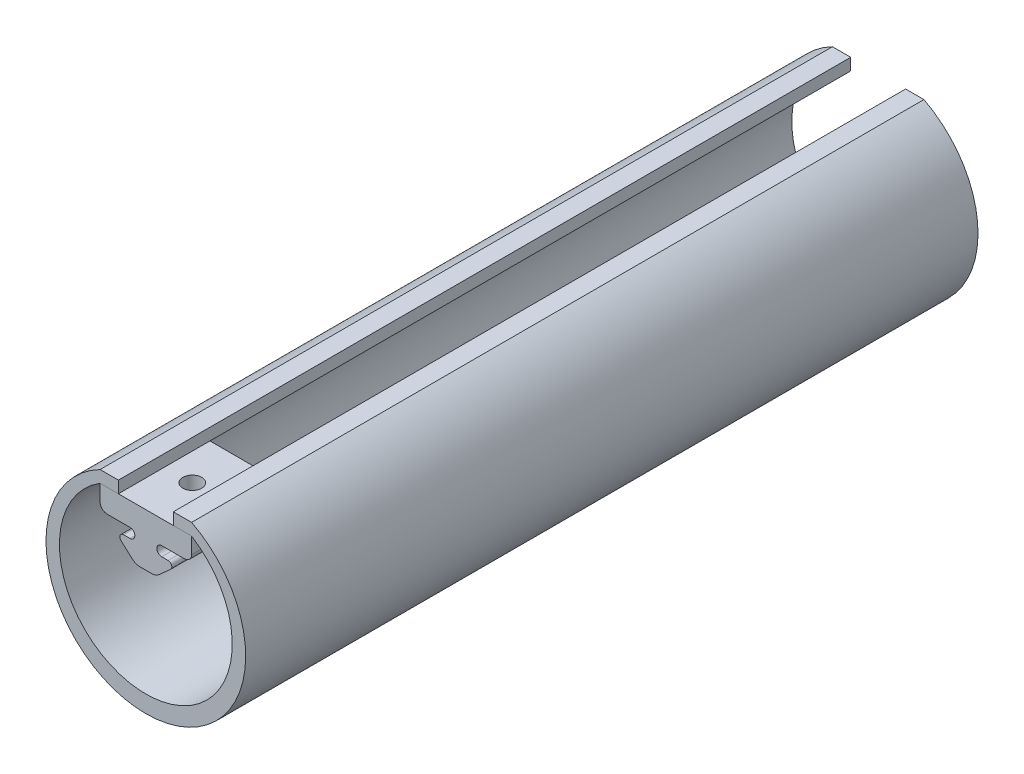
ISO-10303-21;
HEADER;
FILE_DESCRIPTION(('STEP AP214'),'2;1');
FILE_NAME('part.step','',(''),(''),'','','');
FILE_SCHEMA(('AUTOMOTIVE_DESIGN { 1 0 10303 214 1 1 1 1 }'));
ENDSEC;
DATA;
#1=APPLICATION_CONTEXT('core data for automotive mechanical design processes');
#2=APPLICATION_PROTOCOL_DEFINITION('international standard','automotive_design',2000,#1);
#3=PRODUCT_CONTEXT('',#1,'mechanical');
#4=PRODUCT('Part','Part','',(#3));
#5=PRODUCT_RELATED_PRODUCT_CATEGORY('part','',(#4));
#6=PRODUCT_DEFINITION_FORMATION('','',#4);
#7=PRODUCT_DEFINITION_CONTEXT('part definition',#1,'design');
#8=PRODUCT_DEFINITION('design','',#6,#7);
#9=PRODUCT_DEFINITION_SHAPE('','',#8);
#10=(LENGTH_UNIT() NAMED_UNIT(*) SI_UNIT(.MILLI.,.METRE.));
#11=(NAMED_UNIT(*) PLANE_ANGLE_UNIT() SI_UNIT($,.RADIAN.));
#12=(NAMED_UNIT(*) SI_UNIT($,.STERADIAN.) SOLID_ANGLE_UNIT());
#13=UNCERTAINTY_MEASURE_WITH_UNIT(LENGTH_MEASURE(1.E-05),#10,'distance_accuracy_value','');
#14=(GEOMETRIC_REPRESENTATION_CONTEXT(3) GLOBAL_UNCERTAINTY_ASSIGNED_CONTEXT((#13)) GLOBAL_UNIT_ASSIGNED_CONTEXT((#10,
#11,#12)) REPRESENTATION_CONTEXT('',''));
#15=CARTESIAN_POINT('',(0.,0.,0.));
#16=DIRECTION('',(0.,0.,1.));
#17=DIRECTION('',(1.,0.,0.));
#18=AXIS2_PLACEMENT_3D('',#15,#16,#17);
#19=CARTESIAN_POINT('',(0.00499999999999459,-0.919738421910336,-200.));
#20=DIRECTION('',(0.,0.,1.));
#21=DIRECTION('',(1.,0.,0.));
#22=AXIS2_PLACEMENT_3D('',#19,#20,#21);
#23=CYLINDRICAL_SURFACE('',#22,23.5974522798012);
#24=CARTESIAN_POINT('',(0.00499999999999459,-0.919738421910336,0.));
#25=DIRECTION('',(0.,0.,1.));
#26=DIRECTION('',(1.,0.,0.));
#27=AXIS2_PLACEMENT_3D('',#24,#25,#26);
#28=CIRCLE('',#27,23.5974522798012);
#29=CARTESIAN_POINT('',(-12.495,19.095,0.));
#30=VERTEX_POINT('',#29);
#31=CARTESIAN_POINT('',(12.505,19.095,0.));
#32=VERTEX_POINT('',#31);
#33=EDGE_CURVE('E158',#30,#32,#28,.T.);
#34=ORIENTED_EDGE('',*,*,#33,.T.);
#35=DIRECTION('',(0.,0.,1.));
#36=VECTOR('',#35,1.);
#37=CARTESIAN_POINT('',(12.505,19.095,-200.));
#38=LINE('',#37,#36);
#39=CARTESIAN_POINT('',(12.505,19.095,-200.));
#40=VERTEX_POINT('',#39);
#41=EDGE_CURVE('E12',#40,#32,#38,.T.);
#42=ORIENTED_EDGE('',*,*,#41,.F.);
#43=CARTESIAN_POINT('',(0.00499999999999459,-0.919738421910336,-200.));
#44=DIRECTION('',(0.,0.,1.));
#45=DIRECTION('',(1.,0.,0.));
#46=AXIS2_PLACEMENT_3D('',#43,#44,#45);
#47=CIRCLE('',#46,23.5974522798012);
#48=CARTESIAN_POINT('',(-12.495,19.095,-200.));
#49=VERTEX_POINT('',#48);
#50=EDGE_CURVE('E181',#49,#40,#47,.T.);
#51=ORIENTED_EDGE('',*,*,#50,.F.);
#52=DIRECTION('',(0.,0.,1.));
#53=VECTOR('',#52,1.);
#54=CARTESIAN_POINT('',(-12.495,19.095,-200.));
#55=LINE('',#54,#53);
#56=EDGE_CURVE('E62',#49,#30,#55,.T.);
#57=ORIENTED_EDGE('',*,*,#56,.T.);
#58=EDGE_LOOP('',(#34,#42,#51,#57));
#59=FACE_BOUND('',#58,.T.);
#60=ADVANCED_FACE('F59',(#59),#23,.F.);
#61=CARTESIAN_POINT('',(0.,19.095,-200.));
#62=DIRECTION('',(0.,1.,0.));
#63=DIRECTION('',(0.,0.,1.));
#64=AXIS2_PLACEMENT_3D('',#61,#62,#63);
#65=PLANE('',#64);
#66=DIRECTION('',(-1.,0.,0.));
#67=VECTOR('',#66,1.);
#68=CARTESIAN_POINT('',(0.,19.095,0.));
#69=LINE('',#68,#67);
#70=CARTESIAN_POINT('',(7.50499999999998,19.095,0.));
#71=VERTEX_POINT('',#70);
#72=EDGE_CURVE('E111',#32,#71,#69,.T.);
#73=ORIENTED_EDGE('',*,*,#72,.T.);
#74=DIRECTION('',(0.,0.,1.));
#75=VECTOR('',#74,1.);
#76=CARTESIAN_POINT('',(7.50499999999998,19.095,-200.));
#77=LINE('',#76,#75);
#78=CARTESIAN_POINT('',(7.50499999999998,19.095,-200.));
#79=VERTEX_POINT('',#78);
#80=EDGE_CURVE('E69',#79,#71,#77,.T.);
#81=ORIENTED_EDGE('',*,*,#80,.F.);
#82=DIRECTION('',(-1.,0.,0.));
#83=VECTOR('',#82,1.);
#84=CARTESIAN_POINT('',(0.,19.095,-200.));
#85=LINE('',#84,#83);
#86=EDGE_CURVE('E77',#40,#79,#85,.T.);
#87=ORIENTED_EDGE('',*,*,#86,.F.);
#88=ORIENTED_EDGE('',*,*,#41,.T.);
#89=EDGE_LOOP('',(#73,#81,#87,#88));
#90=FACE_BOUND('',#89,.T.);
#91=ADVANCED_FACE('F219',(#90),#65,.F.);
#92=CARTESIAN_POINT('',(7.50499999999998,0.,-200.));
#93=DIRECTION('',(-1.,0.,0.));
#94=DIRECTION('',(0.,0.,1.));
#95=AXIS2_PLACEMENT_3D('',#92,#93,#94);
#96=PLANE('',#95);
#97=DIRECTION('',(0.,-1.,0.));
#98=VECTOR('',#97,1.);
#99=CARTESIAN_POINT('',(7.50499999999998,0.,0.));
#100=LINE('',#99,#98);
#101=CARTESIAN_POINT('',(7.50499999999998,22.3323580948041,0.));
#102=VERTEX_POINT('',#101);
#103=EDGE_CURVE('E136',#102,#71,#100,.T.);
#104=ORIENTED_EDGE('',*,*,#103,.F.);
#105=DIRECTION('',(0.,0.,1.));
#106=VECTOR('',#105,1.);
#107=CARTESIAN_POINT('',(7.50499999999998,22.3323580948041,-200.));
#108=LINE('',#107,#106);
#109=CARTESIAN_POINT('',(7.50499999999998,22.3323580948041,-200.));
#110=VERTEX_POINT('',#109);
#111=EDGE_CURVE('E131',#110,#102,#108,.T.);
#112=ORIENTED_EDGE('',*,*,#111,.F.);
#113=DIRECTION('',(0.,-1.,0.));
#114=VECTOR('',#113,1.);
#115=CARTESIAN_POINT('',(7.50499999999998,0.,-200.));
#116=LINE('',#115,#114);
#117=EDGE_CURVE('E135',#110,#79,#116,.T.);
#118=ORIENTED_EDGE('',*,*,#117,.T.);
#119=ORIENTED_EDGE('',*,*,#80,.T.);
#120=EDGE_LOOP('',(#104,#112,#118,#119));
#121=FACE_BOUND('',#120,.T.);
#122=ADVANCED_FACE('F133',(#121),#96,.T.);
#123=CARTESIAN_POINT('',(0.,22.3323580948041,-200.));
#124=DIRECTION('',(0.,-1.,0.));
#125=DIRECTION('',(0.,0.,-1.));
#126=AXIS2_PLACEMENT_3D('',#123,#124,#125);
#127=PLANE('',#126);
#128=DIRECTION('',(1.,0.,0.));
#129=VECTOR('',#128,1.);
#130=CARTESIAN_POINT('',(0.,22.3323580948041,0.));
#131=LINE('',#130,#129);
#132=CARTESIAN_POINT('',(12.505,22.3323580948041,0.));
#133=VERTEX_POINT('',#132);
#134=EDGE_CURVE('E175',#102,#133,#131,.T.);
#135=ORIENTED_EDGE('',*,*,#134,.T.);
#136=DIRECTION('',(0.,0.,1.));
#137=VECTOR('',#136,1.);
#138=CARTESIAN_POINT('',(12.505,22.3323580948041,-200.));
#139=LINE('',#138,#137);
#140=CARTESIAN_POINT('',(12.505,22.3323580948041,-200.));
#141=VERTEX_POINT('',#140);
#142=EDGE_CURVE('E141',#141,#133,#139,.T.);
#143=ORIENTED_EDGE('',*,*,#142,.F.);
#144=DIRECTION('',(1.,0.,0.));
#145=VECTOR('',#144,1.);
#146=CARTESIAN_POINT('',(0.,22.3323580948041,-200.));
#147=LINE('',#146,#145);
#148=EDGE_CURVE('E144',#110,#141,#147,.T.);
#149=ORIENTED_EDGE('',*,*,#148,.F.);
#150=ORIENTED_EDGE('',*,*,#111,.T.);
#151=EDGE_LOOP('',(#135,#143,#149,#150));
#152=FACE_BOUND('',#151,.T.);
#153=ADVANCED_FACE('F145',(#152),#127,.F.);
#154=CARTESIAN_POINT('',(0.00499999999999459,-1.9006750931802,-200.));
#155=DIRECTION('',(0.,0.,1.));
#156=DIRECTION('',(1.,0.,0.));
#157=AXIS2_PLACEMENT_3D('',#154,#155,#156);
#158=CYLINDRICAL_SURFACE('',#157,27.2670111579899);
#159=CARTESIAN_POINT('',(0.00499999999999459,-1.9006750931802,0.));
#160=DIRECTION('',(0.,0.,1.));
#161=DIRECTION('',(1.,0.,0.));
#162=AXIS2_PLACEMENT_3D('',#159,#160,#161);
#163=CIRCLE('',#162,27.2670111579899);
#164=CARTESIAN_POINT('',(-12.495,22.3323580948041,0.));
#165=VERTEX_POINT('',#164);
#166=EDGE_CURVE('E171',#165,#133,#163,.T.);
#167=ORIENTED_EDGE('',*,*,#166,.F.);
#168=DIRECTION('',(0.,0.,1.));
#169=VECTOR('',#168,1.);
#170=CARTESIAN_POINT('',(-12.495,22.3323580948041,-200.));
#171=LINE('',#170,#169);
#172=CARTESIAN_POINT('',(-12.495,22.3323580948041,-200.));
#173=VERTEX_POINT('',#172);
#174=EDGE_CURVE('E187',#173,#165,#171,.T.);
#175=ORIENTED_EDGE('',*,*,#174,.F.);
#176=CARTESIAN_POINT('',(0.00499999999999459,-1.9006750931802,-200.));
#177=DIRECTION('',(0.,0.,1.));
#178=DIRECTION('',(1.,0.,0.));
#179=AXIS2_PLACEMENT_3D('',#176,#177,#178);
#180=CIRCLE('',#179,27.2670111579899);
#181=EDGE_CURVE('E149',#173,#141,#180,.T.);
#182=ORIENTED_EDGE('',*,*,#181,.T.);
#183=ORIENTED_EDGE('',*,*,#142,.T.);
#184=EDGE_LOOP('',(#167,#175,#182,#183));
#185=FACE_BOUND('',#184,.T.);
#186=ADVANCED_FACE('F232',(#185),#158,.T.);
#187=CARTESIAN_POINT('',(0.,22.3323580948041,-200.));
#188=DIRECTION('',(0.,-1.,0.));
#189=DIRECTION('',(0.,0.,-1.));
#190=AXIS2_PLACEMENT_3D('',#187,#188,#189);
#191=PLANE('',#190);
#192=DIRECTION('',(1.,0.,0.));
#193=VECTOR('',#192,1.);
#194=CARTESIAN_POINT('',(0.,22.3323580948041,0.));
#195=LINE('',#194,#193);
#196=CARTESIAN_POINT('',(-7.49499999999999,22.3323580948041,0.));
#197=VERTEX_POINT('',#196);
#198=EDGE_CURVE('E168',#165,#197,#195,.T.);
#199=ORIENTED_EDGE('',*,*,#198,.T.);
#200=DIRECTION('',(0.,0.,1.));
#201=VECTOR('',#200,1.);
#202=CARTESIAN_POINT('',(-7.49499999999999,22.3323580948041,-200.));
#203=LINE('',#202,#201);
#204=CARTESIAN_POINT('',(-7.49499999999999,22.3323580948041,-200.));
#205=VERTEX_POINT('',#204);
#206=EDGE_CURVE('E190',#205,#197,#203,.T.);
#207=ORIENTED_EDGE('',*,*,#206,.F.);
#208=DIRECTION('',(1.,0.,0.));
#209=VECTOR('',#208,1.);
#210=CARTESIAN_POINT('',(0.,22.3323580948041,-200.));
#211=LINE('',#210,#209);
#212=EDGE_CURVE('E246',#173,#205,#211,.T.);
#213=ORIENTED_EDGE('',*,*,#212,.F.);
#214=ORIENTED_EDGE('',*,*,#174,.T.);
#215=EDGE_LOOP('',(#199,#207,#213,#214));
#216=FACE_BOUND('',#215,.T.);
#217=ADVANCED_FACE('F215',(#216),#191,.F.);
#218=CARTESIAN_POINT('',(-7.49499999999999,0.,-200.));
#219=DIRECTION('',(-1.,0.,0.));
#220=DIRECTION('',(0.,-1.,0.));
#221=AXIS2_PLACEMENT_3D('',#218,#219,#220);
#222=PLANE('',#221);
#223=DIRECTION('',(0.,-1.,0.));
#224=VECTOR('',#223,1.);
#225=CARTESIAN_POINT('',(-7.49499999999999,0.,0.));
#226=LINE('',#225,#224);
#227=CARTESIAN_POINT('',(-7.49499999999999,19.095,0.));
#228=VERTEX_POINT('',#227);
#229=EDGE_CURVE('E165',#197,#228,#226,.T.);
#230=ORIENTED_EDGE('',*,*,#229,.T.);
#231=DIRECTION('',(0.,0.,1.));
#232=VECTOR('',#231,1.);
#233=CARTESIAN_POINT('',(-7.49499999999999,19.095,-200.));
#234=LINE('',#233,#232);
#235=CARTESIAN_POINT('',(-7.49499999999999,19.095,-200.));
#236=VERTEX_POINT('',#235);
#237=EDGE_CURVE('E193',#236,#228,#234,.T.);
#238=ORIENTED_EDGE('',*,*,#237,.F.);
#239=DIRECTION('',(0.,-1.,0.));
#240=VECTOR('',#239,1.);
#241=CARTESIAN_POINT('',(-7.49499999999999,0.,-200.));
#242=LINE('',#241,#240);
#243=EDGE_CURVE('E244',#205,#236,#242,.T.);
#244=ORIENTED_EDGE('',*,*,#243,.F.);
#245=ORIENTED_EDGE('',*,*,#206,.T.);
#246=EDGE_LOOP('',(#230,#238,#244,#245));
#247=FACE_BOUND('',#246,.T.);
#248=ADVANCED_FACE('F209',(#247),#222,.F.);
#249=CARTESIAN_POINT('',(0.,19.095,-200.));
#250=DIRECTION('',(0.,1.,0.));
#251=DIRECTION('',(0.,0.,1.));
#252=AXIS2_PLACEMENT_3D('',#249,#250,#251);
#253=PLANE('',#252);
#254=DIRECTION('',(-1.,0.,0.));
#255=VECTOR('',#254,1.);
#256=CARTESIAN_POINT('',(0.,19.095,0.));
#257=LINE('',#256,#255);
#258=EDGE_CURVE('E162',#228,#30,#257,.T.);
#259=ORIENTED_EDGE('',*,*,#258,.T.);
#260=ORIENTED_EDGE('',*,*,#56,.F.);
#261=DIRECTION('',(-1.,0.,0.));
#262=VECTOR('',#261,1.);
#263=CARTESIAN_POINT('',(0.,19.095,-200.));
#264=LINE('',#263,#262);
#265=EDGE_CURVE('E118',#236,#49,#264,.T.);
#266=ORIENTED_EDGE('',*,*,#265,.F.);
#267=ORIENTED_EDGE('',*,*,#237,.T.);
#268=EDGE_LOOP('',(#259,#260,#266,#267));
#269=FACE_BOUND('',#268,.T.);
#270=ADVANCED_FACE('F207',(#269),#253,.F.);
#271=CARTESIAN_POINT('',(0.,0.,-200.));
#272=DIRECTION('',(0.,0.,1.));
#273=DIRECTION('',(1.,0.,0.));
#274=AXIS2_PLACEMENT_3D('',#271,#272,#273);
#275=PLANE('',#274);
#276=ORIENTED_EDGE('',*,*,#50,.T.);
#277=ORIENTED_EDGE('',*,*,#86,.T.);
#278=ORIENTED_EDGE('',*,*,#117,.F.);
#279=ORIENTED_EDGE('',*,*,#148,.T.);
#280=ORIENTED_EDGE('',*,*,#181,.F.);
#281=ORIENTED_EDGE('',*,*,#212,.T.);
#282=ORIENTED_EDGE('',*,*,#243,.T.);
#283=ORIENTED_EDGE('',*,*,#265,.T.);
#284=EDGE_LOOP('',(#276,#277,#278,#279,#280,#281,#282,#283));
#285=FACE_BOUND('',#284,.T.);
#286=ADVANCED_FACE('F151',(#285),#275,.F.);
#287=CARTESIAN_POINT('',(0.,0.,0.));
#288=DIRECTION('',(0.,0.,1.));
#289=DIRECTION('',(1.,0.,0.));
#290=AXIS2_PLACEMENT_3D('',#287,#288,#289);
#291=PLANE('',#290);
#292=ORIENTED_EDGE('',*,*,#33,.F.);
#293=ORIENTED_EDGE('',*,*,#258,.F.);
#294=ORIENTED_EDGE('',*,*,#229,.F.);
#295=ORIENTED_EDGE('',*,*,#198,.F.);
#296=ORIENTED_EDGE('',*,*,#166,.T.);
#297=ORIENTED_EDGE('',*,*,#134,.F.);
#298=ORIENTED_EDGE('',*,*,#103,.T.);
#299=ORIENTED_EDGE('',*,*,#72,.F.);
#300=EDGE_LOOP('',(#292,#293,#294,#295,#296,#297,#298,#299));
#301=FACE_BOUND('',#300,.T.);
#302=ADVANCED_FACE('F204',(#301),#291,.T.);
#303=CLOSED_SHELL('',(#60,#91,#122,#153,#186,#217,#248,#270,#286,#302));
#304=MANIFOLD_SOLID_BREP('B2',#303);
#305=CARTESIAN_POINT('',(1.55040670748285,4.775,-25.));
#306=DIRECTION('',(0.,-1.,0.));
#307=DIRECTION('',(0.,0.,-1.));
#308=AXIS2_PLACEMENT_3D('',#305,#306,#307);
#309=PLANE('',#308);
#310=CARTESIAN_POINT('',(0.,4.775,-12.7));
#311=DIRECTION('',(0.,1.,0.));
#312=DIRECTION('',(1.,0.,0.));
#313=AXIS2_PLACEMENT_3D('',#310,#311,#312);
#314=CIRCLE('',#313,2.5796875);
#315=CARTESIAN_POINT('',(-1.55040670748285,4.775,-10.6381982056831));
#316=VERTEX_POINT('',#315);
#317=CARTESIAN_POINT('',(1.55040670748285,4.775,-10.6381982056831));
#318=VERTEX_POINT('',#317);
#319=EDGE_CURVE('E352',#316,#318,#314,.T.);
#320=ORIENTED_EDGE('',*,*,#319,.T.);
#321=DIRECTION('',(0.,0.,1.));
#322=VECTOR('',#321,1.);
#323=CARTESIAN_POINT('',(1.55040670748285,4.775,-25.));
#324=LINE('',#323,#322);
#325=CARTESIAN_POINT('',(1.55040670748285,4.775,0.));
#326=VERTEX_POINT('',#325);
#327=EDGE_CURVE('E567',#318,#326,#324,.T.);
#328=ORIENTED_EDGE('',*,*,#327,.T.);
#329=DIRECTION('',(1.,0.,0.));
#330=VECTOR('',#329,1.);
#331=CARTESIAN_POINT('',(1.55040670748285,4.775,0.));
#332=LINE('',#331,#330);
#333=CARTESIAN_POINT('',(-1.55040670748285,4.775,0.));
#334=VERTEX_POINT('',#333);
#335=EDGE_CURVE('E539',#334,#326,#332,.T.);
#336=ORIENTED_EDGE('',*,*,#335,.F.);
#337=DIRECTION('',(0.,0.,1.));
#338=VECTOR('',#337,1.);
#339=CARTESIAN_POINT('',(-1.55040670748285,4.775,-25.));
#340=LINE('',#339,#338);
#341=EDGE_CURVE('E571',#316,#334,#340,.T.);
#342=ORIENTED_EDGE('',*,*,#341,.F.);
#343=EDGE_LOOP('',(#320,#328,#336,#342));
#344=FACE_BOUND('',#343,.T.);
#345=ADVANCED_FACE('F335',(#344),#309,.T.);
#346=CARTESIAN_POINT('',(10.5420688349756,14.7079056929128,-25.));
#347=DIRECTION('',(0.,0.,1.));
#348=DIRECTION('',(1.,0.,0.));
#349=AXIS2_PLACEMENT_3D('',#346,#347,#348);
#350=CYLINDRICAL_SURFACE('',#349,1.96293116518964);
#351=CARTESIAN_POINT('',(10.5420688349756,14.7079056929128,0.));
#352=DIRECTION('',(0.,0.,1.));
#353=DIRECTION('',(1.,0.,0.));
#354=AXIS2_PLACEMENT_3D('',#351,#352,#353);
#355=CIRCLE('',#354,1.96293116518964);
#356=CARTESIAN_POINT('',(10.5320688348104,12.745,0.));
#357=VERTEX_POINT('',#356);
#358=CARTESIAN_POINT('',(12.505,14.7079311651897,0.));
#359=VERTEX_POINT('',#358);
#360=EDGE_CURVE('E505',#357,#359,#355,.T.);
#361=ORIENTED_EDGE('',*,*,#360,.F.);
#362=DIRECTION('',(0.,0.,1.));
#363=VECTOR('',#362,1.);
#364=CARTESIAN_POINT('',(10.5320688348104,12.745,-25.));
#365=LINE('',#364,#363);
#366=CARTESIAN_POINT('',(10.5320688348104,12.745,-25.));
#367=VERTEX_POINT('',#366);
#368=EDGE_CURVE('E57',#367,#357,#365,.T.);
#369=ORIENTED_EDGE('',*,*,#368,.F.);
#370=CARTESIAN_POINT('',(10.5420688349756,14.7079056929128,-25.));
#371=DIRECTION('',(0.,0.,1.));
#372=DIRECTION('',(1.,0.,0.));
#373=AXIS2_PLACEMENT_3D('',#370,#371,#372);
#374=CIRCLE('',#373,1.96293116518964);
#375=CARTESIAN_POINT('',(12.505,14.7079311651897,-25.));
#376=VERTEX_POINT('',#375);
#377=EDGE_CURVE('E556',#367,#376,#374,.T.);
#378=ORIENTED_EDGE('',*,*,#377,.T.);
#379=DIRECTION('',(0.,0.,1.));
#380=VECTOR('',#379,1.);
#381=CARTESIAN_POINT('',(12.505,14.7079311651897,-25.));
#382=LINE('',#381,#380);
#383=EDGE_CURVE('E339',#376,#359,#382,.T.);
#384=ORIENTED_EDGE('',*,*,#383,.T.);
#385=EDGE_LOOP('',(#361,#369,#378,#384));
#386=FACE_BOUND('',#385,.T.);
#387=ADVANCED_FACE('F337',(#386),#350,.T.);
#388=CARTESIAN_POINT('',(4.315,12.745,-25.));
#389=DIRECTION('',(0.,-1.,0.));
#390=DIRECTION('',(1.,0.,0.));
#391=AXIS2_PLACEMENT_3D('',#388,#389,#390);
#392=PLANE('',#391);
#393=DIRECTION('',(1.,0.,0.));
#394=VECTOR('',#393,1.);
#395=CARTESIAN_POINT('',(4.315,12.745,0.));
#396=LINE('',#395,#394);
#397=CARTESIAN_POINT('',(4.315,12.745,0.));
#398=VERTEX_POINT('',#397);
#399=EDGE_CURVE('E554',#398,#357,#396,.T.);
#400=ORIENTED_EDGE('',*,*,#399,.F.);
#401=DIRECTION('',(0.,0.,1.));
#402=VECTOR('',#401,1.);
#403=CARTESIAN_POINT('',(4.315,12.745,-25.));
#404=LINE('',#403,#402);
#405=CARTESIAN_POINT('',(4.315,12.745,-25.));
#406=VERTEX_POINT('',#405);
#407=EDGE_CURVE('E344',#406,#398,#404,.T.);
#408=ORIENTED_EDGE('',*,*,#407,.F.);
#409=DIRECTION('',(1.,0.,0.));
#410=VECTOR('',#409,1.);
#411=CARTESIAN_POINT('',(4.315,12.745,-25.));
#412=LINE('',#411,#410);
#413=EDGE_CURVE('E495',#406,#367,#412,.T.);
#414=ORIENTED_EDGE('',*,*,#413,.T.);
#415=ORIENTED_EDGE('',*,*,#368,.T.);
#416=EDGE_LOOP('',(#400,#408,#414,#415));
#417=FACE_BOUND('',#416,.T.);
#418=ADVANCED_FACE('F592',(#417),#392,.T.);
#419=CARTESIAN_POINT('',(4.315,11.43,-25.));
#420=DIRECTION('',(0.,0.,1.));
#421=DIRECTION('',(1.,0.,0.));
#422=AXIS2_PLACEMENT_3D('',#419,#420,#421);
#423=CYLINDRICAL_SURFACE('',#422,1.315);
#424=CARTESIAN_POINT('',(4.315,11.43,0.));
#425=DIRECTION('',(0.,0.,-1.));
#426=DIRECTION('',(-1.,0.,0.));
#427=AXIS2_PLACEMENT_3D('',#424,#425,#426);
#428=CIRCLE('',#427,1.315);
#429=CARTESIAN_POINT('',(4.315,10.115,0.));
#430=VERTEX_POINT('',#429);
#431=EDGE_CURVE('E482',#430,#398,#428,.T.);
#432=ORIENTED_EDGE('',*,*,#431,.F.);
#433=DIRECTION('',(0.,0.,1.));
#434=VECTOR('',#433,1.);
#435=CARTESIAN_POINT('',(4.315,10.115,-25.));
#436=LINE('',#435,#434);
#437=CARTESIAN_POINT('',(4.315,10.115,-25.));
#438=VERTEX_POINT('',#437);
#439=EDGE_CURVE('E476',#438,#430,#436,.T.);
#440=ORIENTED_EDGE('',*,*,#439,.F.);
#441=CARTESIAN_POINT('',(4.315,11.43,-25.));
#442=DIRECTION('',(0.,0.,-1.));
#443=DIRECTION('',(-1.,0.,0.));
#444=AXIS2_PLACEMENT_3D('',#441,#442,#443);
#445=CIRCLE('',#444,1.315);
#446=EDGE_CURVE('E479',#438,#406,#445,.T.);
#447=ORIENTED_EDGE('',*,*,#446,.T.);
#448=ORIENTED_EDGE('',*,*,#407,.T.);
#449=EDGE_LOOP('',(#432,#440,#447,#448));
#450=FACE_BOUND('',#449,.T.);
#451=ADVANCED_FACE('F478',(#450),#423,.F.);
#452=CARTESIAN_POINT('',(6.085,10.115,-25.));
#453=DIRECTION('',(0.,1.,0.));
#454=DIRECTION('',(-1.,0.,0.));
#455=AXIS2_PLACEMENT_3D('',#452,#453,#454);
#456=PLANE('',#455);
#457=DIRECTION('',(-1.,0.,0.));
#458=VECTOR('',#457,1.);
#459=CARTESIAN_POINT('',(6.085,10.115,0.));
#460=LINE('',#459,#458);
#461=CARTESIAN_POINT('',(6.085,10.115,0.));
#462=VERTEX_POINT('',#461);
#463=EDGE_CURVE('E551',#462,#430,#460,.T.);
#464=ORIENTED_EDGE('',*,*,#463,.F.);
#465=DIRECTION('',(0.,0.,1.));
#466=VECTOR('',#465,1.);
#467=CARTESIAN_POINT('',(6.085,10.115,-25.));
#468=LINE('',#467,#466);
#469=CARTESIAN_POINT('',(6.085,10.115,-25.));
#470=VERTEX_POINT('',#469);
#471=EDGE_CURVE('E487',#470,#462,#468,.T.);
#472=ORIENTED_EDGE('',*,*,#471,.F.);
#473=DIRECTION('',(-1.,0.,0.));
#474=VECTOR('',#473,1.);
#475=CARTESIAN_POINT('',(6.085,10.115,-25.));
#476=LINE('',#475,#474);
#477=EDGE_CURVE('E493',#470,#438,#476,.T.);
#478=ORIENTED_EDGE('',*,*,#477,.T.);
#479=ORIENTED_EDGE('',*,*,#439,.T.);
#480=EDGE_LOOP('',(#464,#472,#478,#479));
#481=FACE_BOUND('',#480,.T.);
#482=ADVANCED_FACE('F497',(#481),#456,.T.);
#483=CARTESIAN_POINT('',(6.085,9.105,-25.));
#484=DIRECTION('',(0.,0.,1.));
#485=DIRECTION('',(1.,0.,0.));
#486=AXIS2_PLACEMENT_3D('',#483,#484,#485);
#487=CYLINDRICAL_SURFACE('',#486,1.01);
#488=CARTESIAN_POINT('',(6.085,9.105,0.));
#489=DIRECTION('',(0.,0.,1.));
#490=DIRECTION('',(-1.,0.,0.));
#491=AXIS2_PLACEMENT_3D('',#488,#489,#490);
#492=CIRCLE('',#491,1.01);
#493=CARTESIAN_POINT('',(6.75861440261653,8.3524419380622,0.));
#494=VERTEX_POINT('',#493);
#495=EDGE_CURVE('E548',#494,#462,#492,.T.);
#496=ORIENTED_EDGE('',*,*,#495,.F.);
#497=DIRECTION('',(0.,0.,1.));
#498=VECTOR('',#497,1.);
#499=CARTESIAN_POINT('',(6.75861440261653,8.3524419380622,-25.));
#500=LINE('',#499,#498);
#501=CARTESIAN_POINT('',(6.75861440261653,8.3524419380622,-25.));
#502=VERTEX_POINT('',#501);
#503=EDGE_CURVE('E560',#502,#494,#500,.T.);
#504=ORIENTED_EDGE('',*,*,#503,.F.);
#505=CARTESIAN_POINT('',(6.085,9.105,-25.));
#506=DIRECTION('',(0.,0.,1.));
#507=DIRECTION('',(-1.,0.,0.));
#508=AXIS2_PLACEMENT_3D('',#505,#506,#507);
#509=CIRCLE('',#508,1.01);
#510=EDGE_CURVE('E498',#502,#470,#509,.T.);
#511=ORIENTED_EDGE('',*,*,#510,.T.);
#512=ORIENTED_EDGE('',*,*,#471,.T.);
#513=EDGE_LOOP('',(#496,#504,#511,#512));
#514=FACE_BOUND('',#513,.T.);
#515=ADVANCED_FACE('F809',(#514),#487,.T.);
#516=CARTESIAN_POINT('',(3.66462220876442,5.58301083530413,-25.));
#517=DIRECTION('',(0.66694495308567,-0.745106992017625,0.));
#518=DIRECTION('',(0.745106992017625,0.66694495308567,0.));
#519=AXIS2_PLACEMENT_3D('',#516,#517,#518);
#520=PLANE('',#519);
#521=DIRECTION('',(0.745106992017625,0.66694495308567,0.));
#522=VECTOR('',#521,1.);
#523=CARTESIAN_POINT('',(3.66462220876442,5.58301083530413,0.));
#524=LINE('',#523,#522);
#525=CARTESIAN_POINT('',(3.66462220876443,5.58301083530413,0.));
#526=VERTEX_POINT('',#525);
#527=EDGE_CURVE('E545',#526,#494,#524,.T.);
#528=ORIENTED_EDGE('',*,*,#527,.F.);
#529=DIRECTION('',(0.,0.,1.));
#530=VECTOR('',#529,1.);
#531=CARTESIAN_POINT('',(3.66462220876443,5.58301083530413,-25.));
#532=LINE('',#531,#530);
#533=CARTESIAN_POINT('',(3.66462220876443,5.58301083530413,-25.));
#534=VERTEX_POINT('',#533);
#535=EDGE_CURVE('E562',#534,#526,#532,.T.);
#536=ORIENTED_EDGE('',*,*,#535,.F.);
#537=DIRECTION('',(0.745106992017625,0.66694495308567,0.));
#538=VECTOR('',#537,1.);
#539=CARTESIAN_POINT('',(3.66462220876442,5.58301083530413,-25.));
#540=LINE('',#539,#538);
#541=EDGE_CURVE('E500',#534,#502,#540,.T.);
#542=ORIENTED_EDGE('',*,*,#541,.T.);
#543=ORIENTED_EDGE('',*,*,#503,.T.);
#544=EDGE_LOOP('',(#528,#536,#542,#543));
#545=FACE_BOUND('',#544,.T.);
#546=ADVANCED_FACE('F619',(#545),#520,.T.);
#547=CARTESIAN_POINT('',(1.55040670748285,7.945,-25.));
#548=DIRECTION('',(0.,0.,1.));
#549=DIRECTION('',(1.,0.,0.));
#550=AXIS2_PLACEMENT_3D('',#547,#548,#549);
#551=CYLINDRICAL_SURFACE('',#550,3.17);
#552=CARTESIAN_POINT('',(1.55040670748285,4.775,-14.7618017943169));
#553=CARTESIAN_POINT('',(1.60740604045821,4.77499829120057,-14.7189442153994));
#554=CARTESIAN_POINT('',(1.66257781547106,4.77653731473618,-14.6737514092));
#555=CARTESIAN_POINT('',(1.76889322437959,4.78209114792903,-14.5790601482722));
#556=CARTESIAN_POINT('',(1.8200397355736,4.78610417068436,-14.5295648232791));
#557=CARTESIAN_POINT('',(1.96675242160227,4.80092576356998,-14.3753361028821));
#558=CARTESIAN_POINT('',(2.05588565359025,4.81452303115963,-14.2646380502744));
#559=CARTESIAN_POINT('',(2.21449192978436,4.84428771040433,-14.0307074588259));
#560=CARTESIAN_POINT('',(2.28400175412247,4.86045022395167,-13.9074989658865));
#561=CARTESIAN_POINT('',(2.40208492778134,4.89094173572603,-13.6511445881945));
#562=CARTESIAN_POINT('',(2.45065409260614,4.90527036709316,-13.5179967235234));
#563=CARTESIAN_POINT('',(2.5265358132137,4.92875618427653,-13.2409544194539));
#564=CARTESIAN_POINT('',(2.55316856059788,4.93774573071455,-13.0968575992915));
#565=CARTESIAN_POINT('',(2.58164280081133,4.94738521681886,-12.8059969458529));
#566=CARTESIAN_POINT('',(2.5834968215375,4.94803937077535,-12.6592344978822));
#567=CARTESIAN_POINT('',(2.56292430361789,4.94103637635508,-12.3753134598267));
#568=CARTESIAN_POINT('',(2.54174874989054,4.93380739133914,-12.238050777274));
#569=CARTESIAN_POINT('',(2.47782190838669,4.91351351507231,-11.969028095893));
#570=CARTESIAN_POINT('',(2.43505524938557,4.90044446690321,-11.8372720898594));
#571=CARTESIAN_POINT('',(2.32818141432141,4.87138999447564,-11.5801199210287));
#572=CARTESIAN_POINT('',(2.26368296217278,4.85535372422185,-11.4548928775934));
#573=CARTESIAN_POINT('',(2.11514865887475,4.82479365840991,-11.2165573027427));
#574=CARTESIAN_POINT('',(2.03113896127296,4.81026787554665,-11.1034328425033));
#575=CARTESIAN_POINT('',(1.88018012417873,4.7916558313887,-10.9315294685844));
#576=CARTESIAN_POINT('',(1.8185579372326,4.78569660671739,-10.8682201108708));
#577=CARTESIAN_POINT('',(1.68903568915766,4.77736654680655,-10.748139136869));
#578=CARTESIAN_POINT('',(1.62113573935703,4.77499564794554,-10.6913674046842));
#579=CARTESIAN_POINT('',(1.55040670748285,4.775,-10.6381982056831));
#580=B_SPLINE_CURVE_WITH_KNOTS('',3,(#552,#553,#554,#555,#556,#557,#558,#559,#560,#561,#562,
#563,#564,#565,#566,#567,#568,#569,#570,#571,#572,#573,#574,#575,#576,#577,#578,#579),
.UNSPECIFIED.,.F.,.F.,(4,2,2,2,2,2,2,2,2,2,2,2,2,4),(0.,0.213764562147627,0.427374908600162,
0.853505887428197,1.27883278487419,1.70424463450298,2.14239063810355,2.58031511071875,
2.99558733329452,3.41115561588503,3.83464594255289,4.25757185141178,4.52272455689054,
4.78787256112298),.UNSPECIFIED.);
#581=CARTESIAN_POINT('',(1.55040670748285,4.775,-14.7618017943169));
#582=VERTEX_POINT('',#581);
#583=EDGE_CURVE('E509',#582,#318,#580,.T.);
#584=ORIENTED_EDGE('',*,*,#583,.F.);
#585=CARTESIAN_POINT('',(1.55040670748285,4.775,-25.));
#586=VERTEX_POINT('',#585);
#587=EDGE_CURVE('E564',#586,#582,#324,.T.);
#588=ORIENTED_EDGE('',*,*,#587,.F.);
#589=CARTESIAN_POINT('',(1.55040670748285,7.945,-25.));
#590=DIRECTION('',(0.,0.,1.));
#591=DIRECTION('',(-1.,0.,0.));
#592=AXIS2_PLACEMENT_3D('',#589,#590,#591);
#593=CIRCLE('',#592,3.17);
#594=EDGE_CURVE('E641',#586,#534,#593,.T.);
#595=ORIENTED_EDGE('',*,*,#594,.T.);
#596=ORIENTED_EDGE('',*,*,#535,.T.);
#597=CARTESIAN_POINT('',(1.55040670748285,7.945,0.));
#598=DIRECTION('',(0.,0.,1.));
#599=DIRECTION('',(-1.,0.,0.));
#600=AXIS2_PLACEMENT_3D('',#597,#598,#599);
#601=CIRCLE('',#600,3.17);
#602=EDGE_CURVE('E542',#326,#526,#601,.T.);
#603=ORIENTED_EDGE('',*,*,#602,.F.);
#604=ORIENTED_EDGE('',*,*,#327,.F.);
#605=EDGE_LOOP('',(#584,#588,#595,#596,#603,#604));
#606=FACE_BOUND('',#605,.T.);
#607=ADVANCED_FACE('F611',(#606),#551,.T.);
#608=CARTESIAN_POINT('',(-1.55040670748285,4.775,-14.7618017943169));
#609=VERTEX_POINT('',#608);
#610=EDGE_CURVE('E624',#582,#609,#314,.T.);
#611=ORIENTED_EDGE('',*,*,#610,.T.);
#612=CARTESIAN_POINT('',(-1.55040670748285,4.775,-25.));
#613=VERTEX_POINT('',#612);
#614=EDGE_CURVE('E568',#613,#609,#340,.T.);
#615=ORIENTED_EDGE('',*,*,#614,.F.);
#616=DIRECTION('',(1.,0.,0.));
#617=VECTOR('',#616,1.);
#618=CARTESIAN_POINT('',(1.55040670748285,4.775,-25.));
#619=LINE('',#618,#617);
#620=EDGE_CURVE('E638',#613,#586,#619,.T.);
#621=ORIENTED_EDGE('',*,*,#620,.T.);
#622=ORIENTED_EDGE('',*,*,#587,.T.);
#623=EDGE_LOOP('',(#611,#615,#621,#622));
#624=FACE_BOUND('',#623,.T.);
#625=ADVANCED_FACE('F604',(#624),#309,.T.);
#626=CARTESIAN_POINT('',(-1.55040670748285,7.945,-25.));
#627=DIRECTION('',(0.,0.,1.));
#628=DIRECTION('',(1.,0.,0.));
#629=AXIS2_PLACEMENT_3D('',#626,#627,#628);
#630=CYLINDRICAL_SURFACE('',#629,3.17);
#631=CARTESIAN_POINT('',(-1.55040670748285,4.775,-10.6381982056831));
#632=CARTESIAN_POINT('',(-1.60740604045821,4.77499829120057,-10.6810557846006));
#633=CARTESIAN_POINT('',(-1.66257781547106,4.77653731473618,-10.7262485908));
#634=CARTESIAN_POINT('',(-1.76889322437958,4.78209114792903,-10.8209398517278));
#635=CARTESIAN_POINT('',(-1.8200397355736,4.78610417068436,-10.8704351767209));
#636=CARTESIAN_POINT('',(-1.96675242160227,4.80092576356998,-11.0246638971179));
#637=CARTESIAN_POINT('',(-2.05588565359025,4.81452303115963,-11.1353619497256));
#638=CARTESIAN_POINT('',(-2.21449192978436,4.84428771040433,-11.3692925411741));
#639=CARTESIAN_POINT('',(-2.28400175412247,4.86045022395167,-11.4925010341135));
#640=CARTESIAN_POINT('',(-2.40208492778134,4.89094173572603,-11.7488554118055));
#641=CARTESIAN_POINT('',(-2.45065409260614,4.90527036709316,-11.8820032764766));
#642=CARTESIAN_POINT('',(-2.5265358132137,4.92875618427653,-12.1590455805461));
#643=CARTESIAN_POINT('',(-2.55316856059788,4.93774573071455,-12.3031424007085));
#644=CARTESIAN_POINT('',(-2.58164280081134,4.94738521681886,-12.5940030541471));
#645=CARTESIAN_POINT('',(-2.5834968215375,4.94803937077535,-12.7407655021178));
#646=CARTESIAN_POINT('',(-2.56292430361789,4.94103637635508,-13.0246865401733));
#647=CARTESIAN_POINT('',(-2.54174874989054,4.93380739133914,-13.161949222726));
#648=CARTESIAN_POINT('',(-2.47782190838669,4.91351351507232,-13.430971904107));
#649=CARTESIAN_POINT('',(-2.43505524938557,4.90044446690321,-13.5627279101406));
#650=CARTESIAN_POINT('',(-2.32818141432142,4.87138999447565,-13.8198800789713));
#651=CARTESIAN_POINT('',(-2.26368296217278,4.85535372422185,-13.9451071224066));
#652=CARTESIAN_POINT('',(-2.11514865887475,4.82479365840991,-14.1834426972573));
#653=CARTESIAN_POINT('',(-2.03113896127297,4.81026787554665,-14.2965671574967));
#654=CARTESIAN_POINT('',(-1.88018012417873,4.7916558313887,-14.4684705314156));
#655=CARTESIAN_POINT('',(-1.8185579372326,4.78569660671739,-14.5317798891292));
#656=CARTESIAN_POINT('',(-1.68903568915766,4.77736654680655,-14.651860863131));
#657=CARTESIAN_POINT('',(-1.62113573935704,4.77499564794554,-14.7086325953158));
#658=CARTESIAN_POINT('',(-1.55040670748285,4.775,-14.7618017943169));
#659=B_SPLINE_CURVE_WITH_KNOTS('',3,(#631,#632,#633,#634,#635,#636,#637,#638,#639,#640,#641,
#642,#643,#644,#645,#646,#647,#648,#649,#650,#651,#652,#653,#654,#655,#656,#657,#658),
.UNSPECIFIED.,.F.,.F.,(4,2,2,2,2,2,2,2,2,2,2,2,2,4),(0.,0.213764562147627,0.427374908600162,
0.853505887428196,1.27883278487418,1.70424463450298,2.14239063810355,2.58031511071874,
2.99558733329451,3.41115561588503,3.83464594255288,4.25757185141178,4.52272455689054,
4.78787256112298),.UNSPECIFIED.);
#660=EDGE_CURVE('E629',#316,#609,#659,.T.);
#661=ORIENTED_EDGE('',*,*,#660,.F.);
#662=ORIENTED_EDGE('',*,*,#341,.T.);
#663=CARTESIAN_POINT('',(-1.55040670748285,7.945,0.));
#664=DIRECTION('',(0.,0.,1.));
#665=DIRECTION('',(1.,0.,0.));
#666=AXIS2_PLACEMENT_3D('',#663,#664,#665);
#667=CIRCLE('',#666,3.17);
#668=CARTESIAN_POINT('',(-3.66462220876442,5.58301083530413,0.));
#669=VERTEX_POINT('',#668);
#670=EDGE_CURVE('E536',#669,#334,#667,.T.);
#671=ORIENTED_EDGE('',*,*,#670,.F.);
#672=DIRECTION('',(0.,0.,1.));
#673=VECTOR('',#672,1.);
#674=CARTESIAN_POINT('',(-3.66462220876442,5.58301083530413,-25.));
#675=LINE('',#674,#673);
#676=CARTESIAN_POINT('',(-3.66462220876442,5.58301083530413,-25.));
#677=VERTEX_POINT('',#676);
#678=EDGE_CURVE('E572',#677,#669,#675,.T.);
#679=ORIENTED_EDGE('',*,*,#678,.F.);
#680=CARTESIAN_POINT('',(-1.55040670748285,7.945,-25.));
#681=DIRECTION('',(0.,0.,1.));
#682=DIRECTION('',(1.,0.,0.));
#683=AXIS2_PLACEMENT_3D('',#680,#681,#682);
#684=CIRCLE('',#683,3.17);
#685=EDGE_CURVE('E634',#677,#613,#684,.T.);
#686=ORIENTED_EDGE('',*,*,#685,.T.);
#687=ORIENTED_EDGE('',*,*,#614,.T.);
#688=EDGE_LOOP('',(#661,#662,#671,#679,#686,#687));
#689=FACE_BOUND('',#688,.T.);
#690=ADVANCED_FACE('F610',(#689),#630,.T.);
#691=CARTESIAN_POINT('',(-3.66462220876442,5.58301083530413,-25.));
#692=DIRECTION('',(-0.66694495308567,-0.745106992017626,0.));
#693=DIRECTION('',(0.745106992017626,-0.66694495308567,0.));
#694=AXIS2_PLACEMENT_3D('',#691,#692,#693);
#695=PLANE('',#694);
#696=DIRECTION('',(0.745106992017625,-0.66694495308567,0.));
#697=VECTOR('',#696,1.);
#698=CARTESIAN_POINT('',(-3.66462220876442,5.58301083530413,0.));
#699=LINE('',#698,#697);
#700=CARTESIAN_POINT('',(-6.75861440261652,8.3524419380622,0.));
#701=VERTEX_POINT('',#700);
#702=EDGE_CURVE('E533',#701,#669,#699,.T.);
#703=ORIENTED_EDGE('',*,*,#702,.F.);
#704=DIRECTION('',(0.,0.,1.));
#705=VECTOR('',#704,1.);
#706=CARTESIAN_POINT('',(-6.75861440261652,8.3524419380622,-25.));
#707=LINE('',#706,#705);
#708=CARTESIAN_POINT('',(-6.75861440261652,8.3524419380622,-25.));
#709=VERTEX_POINT('',#708);
#710=EDGE_CURVE('E574',#709,#701,#707,.T.);
#711=ORIENTED_EDGE('',*,*,#710,.F.);
#712=DIRECTION('',(0.745106992017625,-0.66694495308567,0.));
#713=VECTOR('',#712,1.);
#714=CARTESIAN_POINT('',(-3.66462220876442,5.58301083530413,-25.));
#715=LINE('',#714,#713);
#716=EDGE_CURVE('E639',#709,#677,#715,.T.);
#717=ORIENTED_EDGE('',*,*,#716,.T.);
#718=ORIENTED_EDGE('',*,*,#678,.T.);
#719=EDGE_LOOP('',(#703,#711,#717,#718));
#720=FACE_BOUND('',#719,.T.);
#721=ADVANCED_FACE('F617',(#720),#695,.T.);
#722=CARTESIAN_POINT('',(-6.085,9.105,-25.));
#723=DIRECTION('',(0.,0.,1.));
#724=DIRECTION('',(1.,0.,0.));
#725=AXIS2_PLACEMENT_3D('',#722,#723,#724);
#726=CYLINDRICAL_SURFACE('',#725,1.01);
#727=CARTESIAN_POINT('',(-6.085,9.105,0.));
#728=DIRECTION('',(0.,0.,1.));
#729=DIRECTION('',(1.,0.,0.));
#730=AXIS2_PLACEMENT_3D('',#727,#728,#729);
#731=CIRCLE('',#730,1.01);
#732=CARTESIAN_POINT('',(-6.085,10.115,0.));
#733=VERTEX_POINT('',#732);
#734=EDGE_CURVE('E530',#733,#701,#731,.T.);
#735=ORIENTED_EDGE('',*,*,#734,.F.);
#736=DIRECTION('',(0.,0.,1.));
#737=VECTOR('',#736,1.);
#738=CARTESIAN_POINT('',(-6.085,10.115,-25.));
#739=LINE('',#738,#737);
#740=CARTESIAN_POINT('',(-6.085,10.115,-25.));
#741=VERTEX_POINT('',#740);
#742=EDGE_CURVE('E576',#741,#733,#739,.T.);
#743=ORIENTED_EDGE('',*,*,#742,.F.);
#744=CARTESIAN_POINT('',(-6.085,9.105,-25.));
#745=DIRECTION('',(0.,0.,1.));
#746=DIRECTION('',(1.,0.,0.));
#747=AXIS2_PLACEMENT_3D('',#744,#745,#746);
#748=CIRCLE('',#747,1.01);
#749=EDGE_CURVE('E643',#741,#709,#748,.T.);
#750=ORIENTED_EDGE('',*,*,#749,.T.);
#751=ORIENTED_EDGE('',*,*,#710,.T.);
#752=EDGE_LOOP('',(#735,#743,#750,#751));
#753=FACE_BOUND('',#752,.T.);
#754=ADVANCED_FACE('F785',(#753),#726,.T.);
#755=CARTESIAN_POINT('',(-6.085,10.115,-25.));
#756=DIRECTION('',(0.,1.,0.));
#757=DIRECTION('',(-1.,0.,0.));
#758=AXIS2_PLACEMENT_3D('',#755,#756,#757);
#759=PLANE('',#758);
#760=DIRECTION('',(-1.,0.,0.));
#761=VECTOR('',#760,1.);
#762=CARTESIAN_POINT('',(-6.085,10.115,0.));
#763=LINE('',#762,#761);
#764=CARTESIAN_POINT('',(-4.315,10.115,0.));
#765=VERTEX_POINT('',#764);
#766=EDGE_CURVE('E527',#765,#733,#763,.T.);
#767=ORIENTED_EDGE('',*,*,#766,.F.);
#768=DIRECTION('',(0.,0.,1.));
#769=VECTOR('',#768,1.);
#770=CARTESIAN_POINT('',(-4.315,10.115,-25.));
#771=LINE('',#770,#769);
#772=CARTESIAN_POINT('',(-4.315,10.115,-25.));
#773=VERTEX_POINT('',#772);
#774=EDGE_CURVE('E578',#773,#765,#771,.T.);
#775=ORIENTED_EDGE('',*,*,#774,.F.);
#776=DIRECTION('',(-1.,0.,0.));
#777=VECTOR('',#776,1.);
#778=CARTESIAN_POINT('',(-6.085,10.115,-25.));
#779=LINE('',#778,#777);
#780=EDGE_CURVE('E872',#773,#741,#779,.T.);
#781=ORIENTED_EDGE('',*,*,#780,.T.);
#782=ORIENTED_EDGE('',*,*,#742,.T.);
#783=EDGE_LOOP('',(#767,#775,#781,#782));
#784=FACE_BOUND('',#783,.T.);
#785=ADVANCED_FACE('F775',(#784),#759,.T.);
#786=CARTESIAN_POINT('',(-4.315,11.43,-25.));
#787=DIRECTION('',(0.,0.,1.));
#788=DIRECTION('',(1.,0.,0.));
#789=AXIS2_PLACEMENT_3D('',#786,#787,#788);
#790=CYLINDRICAL_SURFACE('',#789,1.315);
#791=CARTESIAN_POINT('',(-4.315,11.43,0.));
#792=DIRECTION('',(0.,0.,-1.));
#793=DIRECTION('',(1.,0.,0.));
#794=AXIS2_PLACEMENT_3D('',#791,#792,#793);
#795=CIRCLE('',#794,1.315);
#796=CARTESIAN_POINT('',(-4.315,12.745,0.));
#797=VERTEX_POINT('',#796);
#798=EDGE_CURVE('E524',#797,#765,#795,.T.);
#799=ORIENTED_EDGE('',*,*,#798,.F.);
#800=DIRECTION('',(0.,0.,1.));
#801=VECTOR('',#800,1.);
#802=CARTESIAN_POINT('',(-4.315,12.745,-25.));
#803=LINE('',#802,#801);
#804=CARTESIAN_POINT('',(-4.315,12.745,-25.));
#805=VERTEX_POINT('',#804);
#806=EDGE_CURVE('E580',#805,#797,#803,.T.);
#807=ORIENTED_EDGE('',*,*,#806,.F.);
#808=CARTESIAN_POINT('',(-4.315,11.43,-25.));
#809=DIRECTION('',(0.,0.,-1.));
#810=DIRECTION('',(1.,0.,0.));
#811=AXIS2_PLACEMENT_3D('',#808,#809,#810);
#812=CIRCLE('',#811,1.315);
#813=EDGE_CURVE('E868',#805,#773,#812,.T.);
#814=ORIENTED_EDGE('',*,*,#813,.T.);
#815=ORIENTED_EDGE('',*,*,#774,.T.);
#816=EDGE_LOOP('',(#799,#807,#814,#815));
#817=FACE_BOUND('',#816,.T.);
#818=ADVANCED_FACE('F765',(#817),#790,.F.);
#819=CARTESIAN_POINT('',(-4.315,12.745,-25.));
#820=DIRECTION('',(0.,-1.,0.));
#821=DIRECTION('',(1.,0.,0.));
#822=AXIS2_PLACEMENT_3D('',#819,#820,#821);
#823=PLANE('',#822);
#824=DIRECTION('',(1.,0.,0.));
#825=VECTOR('',#824,1.);
#826=CARTESIAN_POINT('',(-4.315,12.745,0.));
#827=LINE('',#826,#825);
#828=CARTESIAN_POINT('',(-10.5320688348104,12.745,0.));
#829=VERTEX_POINT('',#828);
#830=EDGE_CURVE('E521',#829,#797,#827,.T.);
#831=ORIENTED_EDGE('',*,*,#830,.F.);
#832=DIRECTION('',(0.,0.,1.));
#833=VECTOR('',#832,1.);
#834=CARTESIAN_POINT('',(-10.5320688348104,12.745,-25.));
#835=LINE('',#834,#833);
#836=CARTESIAN_POINT('',(-10.5320688348104,12.745,-25.));
#837=VERTEX_POINT('',#836);
#838=EDGE_CURVE('E582',#837,#829,#835,.T.);
#839=ORIENTED_EDGE('',*,*,#838,.F.);
#840=DIRECTION('',(1.,0.,0.));
#841=VECTOR('',#840,1.);
#842=CARTESIAN_POINT('',(-4.315,12.745,-25.));
#843=LINE('',#842,#841);
#844=EDGE_CURVE('E879',#837,#805,#843,.T.);
#845=ORIENTED_EDGE('',*,*,#844,.T.);
#846=ORIENTED_EDGE('',*,*,#806,.T.);
#847=EDGE_LOOP('',(#831,#839,#845,#846));
#848=FACE_BOUND('',#847,.T.);
#849=ADVANCED_FACE('F755',(#848),#823,.T.);
#850=CARTESIAN_POINT('',(-10.5320688348104,14.7079311651896,-25.));
#851=DIRECTION('',(0.,0.,1.));
#852=DIRECTION('',(1.,0.,0.));
#853=AXIS2_PLACEMENT_3D('',#850,#851,#852);
#854=CYLINDRICAL_SURFACE('',#853,1.96293116518964);
#855=CARTESIAN_POINT('',(-10.5320688348104,14.7079311651896,0.));
#856=DIRECTION('',(0.,0.,1.));
#857=DIRECTION('',(-1.,0.,0.));
#858=AXIS2_PLACEMENT_3D('',#855,#856,#857);
#859=CIRCLE('',#858,1.96293116518964);
#860=CARTESIAN_POINT('',(-12.495,14.7079311651897,0.));
#861=VERTEX_POINT('',#860);
#862=EDGE_CURVE('E518',#861,#829,#859,.T.);
#863=ORIENTED_EDGE('',*,*,#862,.F.);
#864=DIRECTION('',(0.,0.,1.));
#865=VECTOR('',#864,1.);
#866=CARTESIAN_POINT('',(-12.495,14.7079311651897,-25.));
#867=LINE('',#866,#865);
#868=CARTESIAN_POINT('',(-12.495,14.7079311651897,-25.));
#869=VERTEX_POINT('',#868);
#870=EDGE_CURVE('E584',#869,#861,#867,.T.);
#871=ORIENTED_EDGE('',*,*,#870,.F.);
#872=CARTESIAN_POINT('',(-10.5320688348104,14.7079311651896,-25.));
#873=DIRECTION('',(0.,0.,1.));
#874=DIRECTION('',(-1.,0.,0.));
#875=AXIS2_PLACEMENT_3D('',#872,#873,#874);
#876=CIRCLE('',#875,1.96293116518964);
#877=EDGE_CURVE('E861',#869,#837,#876,.T.);
#878=ORIENTED_EDGE('',*,*,#877,.T.);
#879=ORIENTED_EDGE('',*,*,#838,.T.);
#880=EDGE_LOOP('',(#863,#871,#878,#879));
#881=FACE_BOUND('',#880,.T.);
#882=ADVANCED_FACE('F745',(#881),#854,.T.);
#883=CARTESIAN_POINT('',(-12.495,14.7079311651897,-25.));
#884=DIRECTION('',(-1.,0.,0.));
#885=DIRECTION('',(0.,0.,1.));
#886=AXIS2_PLACEMENT_3D('',#883,#884,#885);
#887=PLANE('',#886);
#888=DIRECTION('',(0.,-1.,0.));
#889=VECTOR('',#888,1.);
#890=CARTESIAN_POINT('',(-12.495,14.7079311651897,0.));
#891=LINE('',#890,#889);
#892=CARTESIAN_POINT('',(-12.495,19.095,0.));
#893=VERTEX_POINT('',#892);
#894=EDGE_CURVE('E515',#893,#861,#891,.T.);
#895=ORIENTED_EDGE('',*,*,#894,.F.);
#896=DIRECTION('',(0.,0.,1.));
#897=VECTOR('',#896,1.);
#898=CARTESIAN_POINT('',(-12.495,19.095,-25.));
#899=LINE('',#898,#897);
#900=CARTESIAN_POINT('',(-12.495,19.095,-25.));
#901=VERTEX_POINT('',#900);
#902=EDGE_CURVE('E586',#901,#893,#899,.T.);
#903=ORIENTED_EDGE('',*,*,#902,.F.);
#904=DIRECTION('',(0.,-1.,0.));
#905=VECTOR('',#904,1.);
#906=CARTESIAN_POINT('',(-12.495,14.7079311651897,-25.));
#907=LINE('',#906,#905);
#908=EDGE_CURVE('E857',#901,#869,#907,.T.);
#909=ORIENTED_EDGE('',*,*,#908,.T.);
#910=ORIENTED_EDGE('',*,*,#870,.T.);
#911=EDGE_LOOP('',(#895,#903,#909,#910));
#912=FACE_BOUND('',#911,.T.);
#913=ADVANCED_FACE('F700',(#912),#887,.T.);
#914=CARTESIAN_POINT('',(-12.495,19.095,-25.));
#915=DIRECTION('',(0.,1.,0.));
#916=DIRECTION('',(0.,0.,1.));
#917=AXIS2_PLACEMENT_3D('',#914,#915,#916);
#918=PLANE('',#917);
#919=CARTESIAN_POINT('',(0.,19.095,-12.7));
#920=DIRECTION('',(0.,1.,0.));
#921=DIRECTION('',(1.,0.,0.));
#922=AXIS2_PLACEMENT_3D('',#919,#920,#921);
#923=CIRCLE('',#922,2.5796875);
#924=CARTESIAN_POINT('',(2.5796875,19.095,-12.7));
#925=VERTEX_POINT('',#924);
#926=EDGE_CURVE('E846',#925,#925,#923,.T.);
#927=ORIENTED_EDGE('',*,*,#926,.F.);
#928=EDGE_LOOP('',(#927));
#929=FACE_BOUND('',#928,.T.);
#930=DIRECTION('',(-1.,0.,0.));
#931=VECTOR('',#930,1.);
#932=CARTESIAN_POINT('',(-12.495,19.095,0.));
#933=LINE('',#932,#931);
#934=CARTESIAN_POINT('',(12.505,19.095,0.));
#935=VERTEX_POINT('',#934);
#936=EDGE_CURVE('E512',#935,#893,#933,.T.);
#937=ORIENTED_EDGE('',*,*,#936,.F.);
#938=DIRECTION('',(0.,0.,1.));
#939=VECTOR('',#938,1.);
#940=CARTESIAN_POINT('',(12.505,19.095,-25.));
#941=LINE('',#940,#939);
#942=CARTESIAN_POINT('',(12.505,19.095,-25.));
#943=VERTEX_POINT('',#942);
#944=EDGE_CURVE('E587',#943,#935,#941,.T.);
#945=ORIENTED_EDGE('',*,*,#944,.F.);
#946=DIRECTION('',(-1.,0.,0.));
#947=VECTOR('',#946,1.);
#948=CARTESIAN_POINT('',(-12.495,19.095,-25.));
#949=LINE('',#948,#947);
#950=EDGE_CURVE('E883',#943,#901,#949,.T.);
#951=ORIENTED_EDGE('',*,*,#950,.T.);
#952=ORIENTED_EDGE('',*,*,#902,.T.);
#953=EDGE_LOOP('',(#937,#945,#951,#952));
#954=FACE_BOUND('',#953,.T.);
#955=ADVANCED_FACE('F695',(#929,#954),#918,.T.);
#956=CARTESIAN_POINT('',(12.505,14.7079311651897,-25.));
#957=DIRECTION('',(1.,0.,0.));
#958=DIRECTION('',(0.,0.,-1.));
#959=AXIS2_PLACEMENT_3D('',#956,#957,#958);
#960=PLANE('',#959);
#961=DIRECTION('',(0.,1.,0.));
#962=VECTOR('',#961,1.);
#963=CARTESIAN_POINT('',(12.505,14.7079311651897,0.));
#964=LINE('',#963,#962);
#965=EDGE_CURVE('E508',#359,#935,#964,.T.);
#966=ORIENTED_EDGE('',*,*,#965,.F.);
#967=ORIENTED_EDGE('',*,*,#383,.F.);
#968=DIRECTION('',(0.,1.,0.));
#969=VECTOR('',#968,1.);
#970=CARTESIAN_POINT('',(12.505,14.7079311651897,-25.));
#971=LINE('',#970,#969);
#972=EDGE_CURVE('E884',#376,#943,#971,.T.);
#973=ORIENTED_EDGE('',*,*,#972,.T.);
#974=ORIENTED_EDGE('',*,*,#944,.T.);
#975=EDGE_LOOP('',(#966,#967,#973,#974));
#976=FACE_BOUND('',#975,.T.);
#977=ADVANCED_FACE('F589',(#976),#960,.T.);
#978=CARTESIAN_POINT('',(10.5420688349756,14.7079056929128,-25.));
#979=DIRECTION('',(0.,0.,1.));
#980=DIRECTION('',(1.,0.,0.));
#981=AXIS2_PLACEMENT_3D('',#978,#979,#980);
#982=PLANE('',#981);
#983=ORIENTED_EDGE('',*,*,#377,.F.);
#984=ORIENTED_EDGE('',*,*,#413,.F.);
#985=ORIENTED_EDGE('',*,*,#446,.F.);
#986=ORIENTED_EDGE('',*,*,#477,.F.);
#987=ORIENTED_EDGE('',*,*,#510,.F.);
#988=ORIENTED_EDGE('',*,*,#541,.F.);
#989=ORIENTED_EDGE('',*,*,#594,.F.);
#990=ORIENTED_EDGE('',*,*,#620,.F.);
#991=ORIENTED_EDGE('',*,*,#685,.F.);
#992=ORIENTED_EDGE('',*,*,#716,.F.);
#993=ORIENTED_EDGE('',*,*,#749,.F.);
#994=ORIENTED_EDGE('',*,*,#780,.F.);
#995=ORIENTED_EDGE('',*,*,#813,.F.);
#996=ORIENTED_EDGE('',*,*,#844,.F.);
#997=ORIENTED_EDGE('',*,*,#877,.F.);
#998=ORIENTED_EDGE('',*,*,#908,.F.);
#999=ORIENTED_EDGE('',*,*,#950,.F.);
#1000=ORIENTED_EDGE('',*,*,#972,.F.);
#1001=EDGE_LOOP('',(#983,#984,#985,#986,#987,#988,#989,#990,#991,#992,#993,#994,#995,#996,#997,
#998,#999,#1000));
#1002=FACE_BOUND('',#1001,.T.);
#1003=ADVANCED_FACE('F491',(#1002),#982,.F.);
#1004=CARTESIAN_POINT('',(10.5420688349756,14.7079056929128,0.));
#1005=DIRECTION('',(0.,0.,1.));
#1006=DIRECTION('',(1.,0.,0.));
#1007=AXIS2_PLACEMENT_3D('',#1004,#1005,#1006);
#1008=PLANE('',#1007);
#1009=ORIENTED_EDGE('',*,*,#360,.T.);
#1010=ORIENTED_EDGE('',*,*,#965,.T.);
#1011=ORIENTED_EDGE('',*,*,#936,.T.);
#1012=ORIENTED_EDGE('',*,*,#894,.T.);
#1013=ORIENTED_EDGE('',*,*,#862,.T.);
#1014=ORIENTED_EDGE('',*,*,#830,.T.);
#1015=ORIENTED_EDGE('',*,*,#798,.T.);
#1016=ORIENTED_EDGE('',*,*,#766,.T.);
#1017=ORIENTED_EDGE('',*,*,#734,.T.);
#1018=ORIENTED_EDGE('',*,*,#702,.T.);
#1019=ORIENTED_EDGE('',*,*,#670,.T.);
#1020=ORIENTED_EDGE('',*,*,#335,.T.);
#1021=ORIENTED_EDGE('',*,*,#602,.T.);
#1022=ORIENTED_EDGE('',*,*,#527,.T.);
#1023=ORIENTED_EDGE('',*,*,#495,.T.);
#1024=ORIENTED_EDGE('',*,*,#463,.T.);
#1025=ORIENTED_EDGE('',*,*,#431,.T.);
#1026=ORIENTED_EDGE('',*,*,#399,.T.);
#1027=EDGE_LOOP('',(#1009,#1010,#1011,#1012,#1013,#1014,#1015,#1016,#1017,#1018,#1019,#1020,
#1021,#1022,#1023,#1024,#1025,#1026));
#1028=FACE_BOUND('',#1027,.T.);
#1029=ADVANCED_FACE('F591',(#1028),#1008,.T.);
#1030=CARTESIAN_POINT('',(0.,4.775,-12.7));
#1031=DIRECTION('',(0.,1.,0.));
#1032=DIRECTION('',(-1.,0.,0.));
#1033=AXIS2_PLACEMENT_3D('',#1030,#1031,#1032);
#1034=CYLINDRICAL_SURFACE('',#1033,2.5796875);
#1035=ORIENTED_EDGE('',*,*,#583,.T.);
#1036=ORIENTED_EDGE('',*,*,#319,.F.);
#1037=ORIENTED_EDGE('',*,*,#660,.T.);
#1038=ORIENTED_EDGE('',*,*,#610,.F.);
#1039=EDGE_LOOP('',(#1035,#1036,#1037,#1038));
#1040=FACE_BOUND('',#1039,.T.);
#1041=ORIENTED_EDGE('',*,*,#926,.T.);
#1042=EDGE_LOOP('',(#1041));
#1043=FACE_BOUND('',#1042,.T.);
#1044=ADVANCED_FACE('F673',(#1040,#1043),#1034,.F.);
#1045=CLOSED_SHELL('',(#345,#387,#418,#451,#482,#515,#546,#607,#625,#690,#721,#754,#785,#818,
#849,#882,#913,#955,#977,#1003,#1029,#1044));
#1046=MANIFOLD_SOLID_BREP('B6',#1045);
#1047=ADVANCED_BREP_SHAPE_REPRESENTATION('',(#18,#304,#1046),#14);
#1048=SHAPE_DEFINITION_REPRESENTATION(#9,#1047);
ENDSEC;
END-ISO-10303-21;
